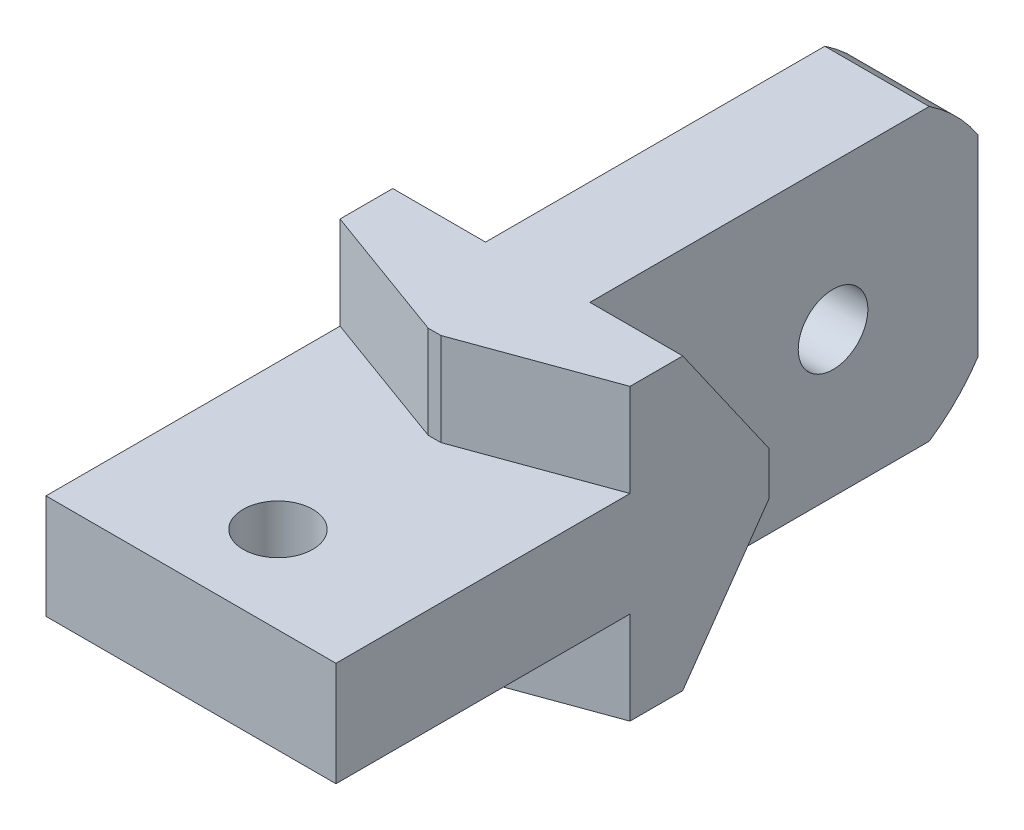
ISO-10303-21;
HEADER;
FILE_DESCRIPTION(('STEP AP214'),'2;1');
FILE_NAME('part.step','',(''),(''),'','','');
FILE_SCHEMA(('AUTOMOTIVE_DESIGN { 1 0 10303 214 1 1 1 1 }'));
ENDSEC;
DATA;
#1=APPLICATION_CONTEXT('core data for automotive mechanical design processes');
#2=APPLICATION_PROTOCOL_DEFINITION('international standard','automotive_design',2000,#1);
#3=PRODUCT_CONTEXT('',#1,'mechanical');
#4=PRODUCT('Part','Part','',(#3));
#5=PRODUCT_RELATED_PRODUCT_CATEGORY('part','',(#4));
#6=PRODUCT_DEFINITION_FORMATION('','',#4);
#7=PRODUCT_DEFINITION_CONTEXT('part definition',#1,'design');
#8=PRODUCT_DEFINITION('design','',#6,#7);
#9=PRODUCT_DEFINITION_SHAPE('','',#8);
#10=(LENGTH_UNIT() NAMED_UNIT(*) SI_UNIT(.MILLI.,.METRE.));
#11=(NAMED_UNIT(*) PLANE_ANGLE_UNIT() SI_UNIT($,.RADIAN.));
#12=(NAMED_UNIT(*) SI_UNIT($,.STERADIAN.) SOLID_ANGLE_UNIT());
#13=UNCERTAINTY_MEASURE_WITH_UNIT(LENGTH_MEASURE(1.E-05),#10,'distance_accuracy_value','');
#14=(GEOMETRIC_REPRESENTATION_CONTEXT(3) GLOBAL_UNCERTAINTY_ASSIGNED_CONTEXT((#13)) GLOBAL_UNIT_ASSIGNED_CONTEXT((#10,
#11,#12)) REPRESENTATION_CONTEXT('',''));
#15=CARTESIAN_POINT('',(0.,0.,0.));
#16=DIRECTION('',(0.,0.,1.));
#17=DIRECTION('',(1.,0.,0.));
#18=AXIS2_PLACEMENT_3D('',#15,#16,#17);
#19=CARTESIAN_POINT('',(12.5,12.5,-68.3590613364812));
#20=DIRECTION('',(-1.,0.,0.));
#21=DIRECTION('',(0.,-1.,0.));
#22=AXIS2_PLACEMENT_3D('',#19,#20,#21);
#23=PLANE('',#22);
#24=DIRECTION('',(0.,-0.819152044288995,-0.573576436351042));
#25=VECTOR('',#24,1.);
#26=CARTESIAN_POINT('',(12.5,-3.22121734763681,-45.9068361178939));
#27=LINE('',#26,#25);
#28=CARTESIAN_POINT('',(12.5,12.5,-34.8987212212454));
#29=VERTEX_POINT('',#28);
#30=CARTESIAN_POINT('',(12.5,1.84553013480768,-42.3590613364812));
#31=VERTEX_POINT('',#30);
#32=EDGE_CURVE('E522',#29,#31,#27,.T.);
#33=ORIENTED_EDGE('',*,*,#32,.F.);
#34=DIRECTION('',(0.,0.,1.));
#35=VECTOR('',#34,1.);
#36=CARTESIAN_POINT('',(12.5,12.5,-68.3590613364812));
#37=LINE('',#36,#35);
#38=CARTESIAN_POINT('',(12.5,12.5,-30.3518500842764));
#39=VERTEX_POINT('',#38);
#40=EDGE_CURVE('E468',#29,#39,#37,.T.);
#41=ORIENTED_EDGE('',*,*,#40,.T.);
#42=DIRECTION('',(0.,-1.,0.));
#43=VECTOR('',#42,1.);
#44=CARTESIAN_POINT('',(12.5,12.5,-30.3518500842764));
#45=LINE('',#44,#43);
#46=CARTESIAN_POINT('',(12.5,4.5,-30.3518500842764));
#47=VERTEX_POINT('',#46);
#48=EDGE_CURVE('E484',#39,#47,#45,.T.);
#49=ORIENTED_EDGE('',*,*,#48,.T.);
#50=DIRECTION('',(0.,0.,1.));
#51=VECTOR('',#50,1.);
#52=CARTESIAN_POINT('',(12.5,4.5,-26.));
#53=LINE('',#52,#51);
#54=CARTESIAN_POINT('',(12.5,4.5,-5.));
#55=VERTEX_POINT('',#54);
#56=EDGE_CURVE('E461',#47,#55,#53,.T.);
#57=ORIENTED_EDGE('',*,*,#56,.T.);
#58=DIRECTION('',(0.,1.,0.));
#59=VECTOR('',#58,1.);
#60=CARTESIAN_POINT('',(12.5,-4.5,-5.));
#61=LINE('',#60,#59);
#62=CARTESIAN_POINT('',(12.5,-4.5,-5.00000000000001));
#63=VERTEX_POINT('',#62);
#64=EDGE_CURVE('E417',#63,#55,#61,.T.);
#65=ORIENTED_EDGE('',*,*,#64,.F.);
#66=DIRECTION('',(0.,0.,1.));
#67=VECTOR('',#66,1.);
#68=CARTESIAN_POINT('',(12.5,-4.5,-26.));
#69=LINE('',#68,#67);
#70=CARTESIAN_POINT('',(12.5,-4.5,-30.3518500842764));
#71=VERTEX_POINT('',#70);
#72=EDGE_CURVE('E447',#71,#63,#69,.T.);
#73=ORIENTED_EDGE('',*,*,#72,.F.);
#74=DIRECTION('',(0.,1.,0.));
#75=VECTOR('',#74,1.);
#76=CARTESIAN_POINT('',(12.5,12.5,-30.3518500842764));
#77=LINE('',#76,#75);
#78=CARTESIAN_POINT('',(12.5,-12.5,-30.3518500842764));
#79=VERTEX_POINT('',#78);
#80=EDGE_CURVE('E577',#79,#71,#77,.T.);
#81=ORIENTED_EDGE('',*,*,#80,.F.);
#82=DIRECTION('',(0.,0.,1.));
#83=VECTOR('',#82,1.);
#84=CARTESIAN_POINT('',(12.5,-12.5,-68.3590613364812));
#85=LINE('',#84,#83);
#86=CARTESIAN_POINT('',(12.5,-12.5,-34.8987212212454));
#87=VERTEX_POINT('',#86);
#88=EDGE_CURVE('E451',#87,#79,#85,.T.);
#89=ORIENTED_EDGE('',*,*,#88,.F.);
#90=DIRECTION('',(0.,0.819152044288995,-0.573576436351042));
#91=VECTOR('',#90,1.);
#92=CARTESIAN_POINT('',(12.5,19.9964691392078,-57.6529938777177));
#93=LINE('',#92,#91);
#94=CARTESIAN_POINT('',(12.5,-1.8455301348077,-42.3590613364812));
#95=VERTEX_POINT('',#94);
#96=EDGE_CURVE('E546',#87,#95,#93,.T.);
#97=ORIENTED_EDGE('',*,*,#96,.T.);
#98=DIRECTION('',(0.,-1.,0.));
#99=VECTOR('',#98,1.);
#100=CARTESIAN_POINT('',(12.5,-12.5,-42.3590613364812));
#101=LINE('',#100,#99);
#102=EDGE_CURVE('E430',#31,#95,#101,.T.);
#103=ORIENTED_EDGE('',*,*,#102,.F.);
#104=EDGE_LOOP('',(#33,#41,#49,#57,#65,#73,#81,#89,#97,#103));
#105=FACE_BOUND('',#104,.T.);
#106=ADVANCED_FACE('F219',(#105),#23,.F.);
#107=CARTESIAN_POINT('',(12.5,12.5,-68.3590613364812));
#108=DIRECTION('',(0.,1.,0.));
#109=DIRECTION('',(-1.,0.,0.));
#110=AXIS2_PLACEMENT_3D('',#107,#108,#109);
#111=PLANE('',#110);
#112=DIRECTION('',(-1.,0.,0.));
#113=VECTOR('',#112,1.);
#114=CARTESIAN_POINT('',(5.49999999999996,12.5,-64.1506233123697));
#115=LINE('',#114,#113);
#116=CARTESIAN_POINT('',(4.49999999999996,12.5,-64.1506233123697));
#117=VERTEX_POINT('',#116);
#118=CARTESIAN_POINT('',(-4.50000000000004,12.5,-64.1506233123697));
#119=VERTEX_POINT('',#118);
#120=EDGE_CURVE('E235',#117,#119,#115,.T.);
#121=ORIENTED_EDGE('',*,*,#120,.T.);
#122=DIRECTION('',(0.,0.,-1.));
#123=VECTOR('',#122,1.);
#124=CARTESIAN_POINT('',(-4.50000000000004,12.5,-42.3590613364812));
#125=LINE('',#124,#123);
#126=CARTESIAN_POINT('',(-4.49999999999996,12.5,-34.8987212212454));
#127=VERTEX_POINT('',#126);
#128=EDGE_CURVE('E381',#127,#119,#125,.T.);
#129=ORIENTED_EDGE('',*,*,#128,.F.);
#130=DIRECTION('',(1.,0.,0.));
#131=VECTOR('',#130,1.);
#132=CARTESIAN_POINT('',(12.4999999999999,12.5,-34.8987212212454));
#133=LINE('',#132,#131);
#134=CARTESIAN_POINT('',(-12.5,12.5,-34.8987212212454));
#135=VERTEX_POINT('',#134);
#136=EDGE_CURVE('E530',#135,#127,#133,.T.);
#137=ORIENTED_EDGE('',*,*,#136,.F.);
#138=DIRECTION('',(0.,0.,1.));
#139=VECTOR('',#138,1.);
#140=CARTESIAN_POINT('',(-12.5,12.5,-68.3590613364812));
#141=LINE('',#140,#139);
#142=CARTESIAN_POINT('',(-12.5,12.5,-30.3518500842764));
#143=VERTEX_POINT('',#142);
#144=EDGE_CURVE('E471',#135,#143,#141,.T.);
#145=ORIENTED_EDGE('',*,*,#144,.T.);
#146=DIRECTION('',(0.939692620785909,0.,0.342020143325666));
#147=VECTOR('',#146,1.);
#148=CARTESIAN_POINT('',(-2.63972669684068,12.5,-26.7630041001967));
#149=LINE('',#148,#147);
#150=CARTESIAN_POINT('',(-0.543390160598878,12.5,-26.));
#151=VERTEX_POINT('',#150);
#152=EDGE_CURVE('E477',#143,#151,#149,.T.);
#153=ORIENTED_EDGE('',*,*,#152,.T.);
#154=DIRECTION('',(1.,0.,0.));
#155=VECTOR('',#154,1.);
#156=CARTESIAN_POINT('',(0.,12.5,-26.));
#157=LINE('',#156,#155);
#158=CARTESIAN_POINT('',(0.54339016059887,12.5,-26.));
#159=VERTEX_POINT('',#158);
#160=EDGE_CURVE('E457',#151,#159,#157,.T.);
#161=ORIENTED_EDGE('',*,*,#160,.T.);
#162=DIRECTION('',(0.939692620785909,0.,-0.342020143325666));
#163=VECTOR('',#162,1.);
#164=CARTESIAN_POINT('',(-8.29267435211167,12.5,-22.7839355293175));
#165=LINE('',#164,#163);
#166=EDGE_CURVE('E593',#159,#39,#165,.T.);
#167=ORIENTED_EDGE('',*,*,#166,.T.);
#168=ORIENTED_EDGE('',*,*,#40,.F.);
#169=DIRECTION('',(-1.,0.,0.));
#170=VECTOR('',#169,1.);
#171=CARTESIAN_POINT('',(12.5000000000001,12.5,-34.8987212212454));
#172=LINE('',#171,#170);
#173=CARTESIAN_POINT('',(4.49999999999996,12.5,-34.8987212212454));
#174=VERTEX_POINT('',#173);
#175=EDGE_CURVE('E525',#29,#174,#172,.T.);
#176=ORIENTED_EDGE('',*,*,#175,.T.);
#177=DIRECTION('',(0.,0.,-1.));
#178=VECTOR('',#177,1.);
#179=CARTESIAN_POINT('',(4.49999999999996,12.5,-42.3590613364812));
#180=LINE('',#179,#178);
#181=EDGE_CURVE('E384',#174,#117,#180,.T.);
#182=ORIENTED_EDGE('',*,*,#181,.T.);
#183=EDGE_LOOP('',(#121,#129,#137,#145,#153,#161,#167,#168,#176,#182));
#184=FACE_BOUND('',#183,.T.);
#185=ADVANCED_FACE('F379',(#184),#111,.T.);
#186=CARTESIAN_POINT('',(0.,0.,-42.3590613364812));
#187=DIRECTION('',(0.,0.,-1.));
#188=DIRECTION('',(-1.,0.,0.));
#189=AXIS2_PLACEMENT_3D('',#186,#187,#188);
#190=PLANE('',#189);
#191=DIRECTION('',(0.,1.,0.));
#192=VECTOR('',#191,1.);
#193=CARTESIAN_POINT('',(4.5,0.,-42.3590613364812));
#194=LINE('',#193,#192);
#195=CARTESIAN_POINT('',(4.49999999999999,-1.84553013480768,-42.3590613364812));
#196=VERTEX_POINT('',#195);
#197=CARTESIAN_POINT('',(4.49999999999999,1.84553013480767,-42.3590613364812));
#198=VERTEX_POINT('',#197);
#199=EDGE_CURVE('E402',#196,#198,#194,.T.);
#200=ORIENTED_EDGE('',*,*,#199,.T.);
#201=DIRECTION('',(1.,0.,0.));
#202=VECTOR('',#201,1.);
#203=CARTESIAN_POINT('',(0.,1.84553013480765,-42.3590613364812));
#204=LINE('',#203,#202);
#205=EDGE_CURVE('E509',#198,#31,#204,.T.);
#206=ORIENTED_EDGE('',*,*,#205,.T.);
#207=ORIENTED_EDGE('',*,*,#102,.T.);
#208=DIRECTION('',(1.,0.,0.));
#209=VECTOR('',#208,1.);
#210=CARTESIAN_POINT('',(0.,-1.84553013480765,-42.3590613364812));
#211=LINE('',#210,#209);
#212=EDGE_CURVE('E542',#196,#95,#211,.T.);
#213=ORIENTED_EDGE('',*,*,#212,.F.);
#214=EDGE_LOOP('',(#200,#206,#207,#213));
#215=FACE_BOUND('',#214,.T.);
#216=ADVANCED_FACE('F652',(#215),#190,.T.);
#217=CARTESIAN_POINT('',(12.5,-12.5,-68.3590613364812));
#218=DIRECTION('',(0.,1.,0.));
#219=DIRECTION('',(-1.,0.,0.));
#220=AXIS2_PLACEMENT_3D('',#217,#218,#219);
#221=PLANE('',#220);
#222=DIRECTION('',(0.,0.,-1.));
#223=VECTOR('',#222,1.);
#224=CARTESIAN_POINT('',(-4.49999999999996,-12.5,-42.3590613364812));
#225=LINE('',#224,#223);
#226=CARTESIAN_POINT('',(-4.49999999999996,-12.5,-34.8987212212454));
#227=VERTEX_POINT('',#226);
#228=CARTESIAN_POINT('',(-4.49999999999996,-12.5,-64.1506233123697));
#229=VERTEX_POINT('',#228);
#230=EDGE_CURVE('E393',#227,#229,#225,.T.);
#231=ORIENTED_EDGE('',*,*,#230,.T.);
#232=DIRECTION('',(-1.,0.,0.));
#233=VECTOR('',#232,1.);
#234=CARTESIAN_POINT('',(5.50000000000004,-12.5,-64.1506233123697));
#235=LINE('',#234,#233);
#236=CARTESIAN_POINT('',(4.50000000000004,-12.5,-64.1506233123697));
#237=VERTEX_POINT('',#236);
#238=EDGE_CURVE('E375',#237,#229,#235,.T.);
#239=ORIENTED_EDGE('',*,*,#238,.F.);
#240=DIRECTION('',(0.,0.,-1.));
#241=VECTOR('',#240,1.);
#242=CARTESIAN_POINT('',(4.50000000000004,-12.5,-42.3590613364812));
#243=LINE('',#242,#241);
#244=CARTESIAN_POINT('',(4.49999999999996,-12.5,-34.8987212212454));
#245=VERTEX_POINT('',#244);
#246=EDGE_CURVE('E412',#245,#237,#243,.T.);
#247=ORIENTED_EDGE('',*,*,#246,.F.);
#248=DIRECTION('',(1.,0.,0.));
#249=VECTOR('',#248,1.);
#250=CARTESIAN_POINT('',(12.5000000000001,-12.5,-34.8987212212454));
#251=LINE('',#250,#249);
#252=EDGE_CURVE('E550',#245,#87,#251,.T.);
#253=ORIENTED_EDGE('',*,*,#252,.T.);
#254=ORIENTED_EDGE('',*,*,#88,.T.);
#255=DIRECTION('',(0.939692620785909,0.,-0.342020143325666));
#256=VECTOR('',#255,1.);
#257=CARTESIAN_POINT('',(24.715282235828,-12.5,-34.7978492212784));
#258=LINE('',#257,#256);
#259=CARTESIAN_POINT('',(0.543390160598841,-12.5,-26.));
#260=VERTEX_POINT('',#259);
#261=EDGE_CURVE('E492',#260,#79,#258,.T.);
#262=ORIENTED_EDGE('',*,*,#261,.F.);
#263=DIRECTION('',(-1.,0.,0.));
#264=VECTOR('',#263,1.);
#265=CARTESIAN_POINT('',(0.,-12.5,-26.));
#266=LINE('',#265,#264);
#267=CARTESIAN_POINT('',(-0.543390160598876,-12.5,-26.));
#268=VERTEX_POINT('',#267);
#269=EDGE_CURVE('E439',#260,#268,#266,.T.);
#270=ORIENTED_EDGE('',*,*,#269,.T.);
#271=DIRECTION('',(-0.939692620785909,0.,-0.342020143325666));
#272=VECTOR('',#271,1.);
#273=CARTESIAN_POINT('',(-2.63972669684068,-12.5,-26.7630041001967));
#274=LINE('',#273,#272);
#275=CARTESIAN_POINT('',(-12.5,-12.5,-30.3518500842764));
#276=VERTEX_POINT('',#275);
#277=EDGE_CURVE('E488',#268,#276,#274,.T.);
#278=ORIENTED_EDGE('',*,*,#277,.T.);
#279=DIRECTION('',(0.,0.,1.));
#280=VECTOR('',#279,1.);
#281=CARTESIAN_POINT('',(-12.5,-12.5,-68.3590613364812));
#282=LINE('',#281,#280);
#283=CARTESIAN_POINT('',(-12.5,-12.5,-34.8987212212454));
#284=VERTEX_POINT('',#283);
#285=EDGE_CURVE('E474',#284,#276,#282,.T.);
#286=ORIENTED_EDGE('',*,*,#285,.F.);
#287=DIRECTION('',(-1.,0.,0.));
#288=VECTOR('',#287,1.);
#289=CARTESIAN_POINT('',(12.4999999999999,-12.5,-34.8987212212454));
#290=LINE('',#289,#288);
#291=EDGE_CURVE('E566',#227,#284,#290,.T.);
#292=ORIENTED_EDGE('',*,*,#291,.F.);
#293=EDGE_LOOP('',(#231,#239,#247,#253,#254,#262,#270,#278,#286,#292));
#294=FACE_BOUND('',#293,.T.);
#295=ADVANCED_FACE('F221',(#294),#221,.F.);
#296=CARTESIAN_POINT('',(-12.5,12.5,-68.3590613364812));
#297=DIRECTION('',(-1.,0.,0.));
#298=DIRECTION('',(0.,-1.,0.));
#299=AXIS2_PLACEMENT_3D('',#296,#297,#298);
#300=PLANE('',#299);
#301=DIRECTION('',(0.,0.819152044288995,0.573576436351042));
#302=VECTOR('',#301,1.);
#303=CARTESIAN_POINT('',(-12.5,-3.22121734763681,-45.9068361178939));
#304=LINE('',#303,#302);
#305=CARTESIAN_POINT('',(-12.5,1.8455301348077,-42.3590613364812));
#306=VERTEX_POINT('',#305);
#307=EDGE_CURVE('E533',#306,#135,#304,.T.);
#308=ORIENTED_EDGE('',*,*,#307,.F.);
#309=DIRECTION('',(0.,1.,0.));
#310=VECTOR('',#309,1.);
#311=CARTESIAN_POINT('',(-12.5,-12.5,-42.3590613364812));
#312=LINE('',#311,#310);
#313=CARTESIAN_POINT('',(-12.5,-1.84553013480768,-42.3590613364812));
#314=VERTEX_POINT('',#313);
#315=EDGE_CURVE('E426',#314,#306,#312,.T.);
#316=ORIENTED_EDGE('',*,*,#315,.F.);
#317=DIRECTION('',(0.,-0.819152044288995,0.573576436351042));
#318=VECTOR('',#317,1.);
#319=CARTESIAN_POINT('',(-12.5,19.9964691392078,-57.6529938777177));
#320=LINE('',#319,#318);
#321=EDGE_CURVE('E562',#314,#284,#320,.T.);
#322=ORIENTED_EDGE('',*,*,#321,.T.);
#323=ORIENTED_EDGE('',*,*,#285,.T.);
#324=DIRECTION('',(0.,-1.,0.));
#325=VECTOR('',#324,1.);
#326=CARTESIAN_POINT('',(-12.5,12.5,-30.3518500842764));
#327=LINE('',#326,#325);
#328=CARTESIAN_POINT('',(-12.5,-4.5,-30.3518500842764));
#329=VERTEX_POINT('',#328);
#330=EDGE_CURVE('E588',#329,#276,#327,.T.);
#331=ORIENTED_EDGE('',*,*,#330,.F.);
#332=DIRECTION('',(0.,0.,1.));
#333=VECTOR('',#332,1.);
#334=CARTESIAN_POINT('',(-12.5,-4.5,-26.));
#335=LINE('',#334,#333);
#336=CARTESIAN_POINT('',(-12.5,-4.5,-5.));
#337=VERTEX_POINT('',#336);
#338=EDGE_CURVE('E448',#329,#337,#335,.T.);
#339=ORIENTED_EDGE('',*,*,#338,.T.);
#340=DIRECTION('',(0.,-1.,0.));
#341=VECTOR('',#340,1.);
#342=CARTESIAN_POINT('',(-12.5,4.5,-5.));
#343=LINE('',#342,#341);
#344=CARTESIAN_POINT('',(-12.5,4.5,-5.));
#345=VERTEX_POINT('',#344);
#346=EDGE_CURVE('E619',#345,#337,#343,.T.);
#347=ORIENTED_EDGE('',*,*,#346,.F.);
#348=DIRECTION('',(0.,0.,1.));
#349=VECTOR('',#348,1.);
#350=CARTESIAN_POINT('',(-12.5,4.5,-26.));
#351=LINE('',#350,#349);
#352=CARTESIAN_POINT('',(-12.5,4.5,-30.3518500842764));
#353=VERTEX_POINT('',#352);
#354=EDGE_CURVE('E443',#353,#345,#351,.T.);
#355=ORIENTED_EDGE('',*,*,#354,.F.);
#356=DIRECTION('',(0.,1.,0.));
#357=VECTOR('',#356,1.);
#358=CARTESIAN_POINT('',(-12.5,12.5,-30.3518500842764));
#359=LINE('',#358,#357);
#360=EDGE_CURVE('E611',#353,#143,#359,.T.);
#361=ORIENTED_EDGE('',*,*,#360,.T.);
#362=ORIENTED_EDGE('',*,*,#144,.F.);
#363=EDGE_LOOP('',(#308,#316,#322,#323,#331,#339,#347,#355,#361,#362));
#364=FACE_BOUND('',#363,.T.);
#365=ADVANCED_FACE('F658',(#364),#300,.T.);
#366=DIRECTION('',(-1.,0.,0.));
#367=VECTOR('',#366,1.);
#368=CARTESIAN_POINT('',(0.,1.84553013480765,-42.3590613364812));
#369=LINE('',#368,#367);
#370=CARTESIAN_POINT('',(-4.49999999999999,1.84553013480768,-42.3590613364812));
#371=VERTEX_POINT('',#370);
#372=EDGE_CURVE('E536',#371,#306,#369,.T.);
#373=ORIENTED_EDGE('',*,*,#372,.F.);
#374=DIRECTION('',(0.,1.,0.));
#375=VECTOR('',#374,1.);
#376=CARTESIAN_POINT('',(-4.5,0.,-42.3590613364812));
#377=LINE('',#376,#375);
#378=CARTESIAN_POINT('',(-4.49999999999999,-1.84553013480768,-42.3590613364812));
#379=VERTEX_POINT('',#378);
#380=EDGE_CURVE('E399',#379,#371,#377,.T.);
#381=ORIENTED_EDGE('',*,*,#380,.F.);
#382=DIRECTION('',(-1.,0.,0.));
#383=VECTOR('',#382,1.);
#384=CARTESIAN_POINT('',(0.,-1.84553013480765,-42.3590613364812));
#385=LINE('',#384,#383);
#386=EDGE_CURVE('E558',#379,#314,#385,.T.);
#387=ORIENTED_EDGE('',*,*,#386,.T.);
#388=ORIENTED_EDGE('',*,*,#315,.T.);
#389=EDGE_LOOP('',(#373,#381,#387,#388));
#390=FACE_BOUND('',#389,.T.);
#391=ADVANCED_FACE('F660',(#390),#190,.T.);
#392=CARTESIAN_POINT('',(0.,0.,-26.));
#393=DIRECTION('',(0.,0.,1.));
#394=DIRECTION('',(-1.,0.,0.));
#395=AXIS2_PLACEMENT_3D('',#392,#393,#394);
#396=PLANE('',#395);
#397=ORIENTED_EDGE('',*,*,#269,.F.);
#398=DIRECTION('',(0.,1.,0.));
#399=VECTOR('',#398,1.);
#400=CARTESIAN_POINT('',(0.543390160598869,0.,-26.));
#401=LINE('',#400,#399);
#402=CARTESIAN_POINT('',(0.543390160598867,-4.5,-26.));
#403=VERTEX_POINT('',#402);
#404=EDGE_CURVE('E573',#260,#403,#401,.T.);
#405=ORIENTED_EDGE('',*,*,#404,.T.);
#406=DIRECTION('',(1.,0.,0.));
#407=VECTOR('',#406,1.);
#408=CARTESIAN_POINT('',(0.,-4.5,-26.));
#409=LINE('',#408,#407);
#410=CARTESIAN_POINT('',(-0.543390160598867,-4.5,-26.));
#411=VERTEX_POINT('',#410);
#412=EDGE_CURVE('E442',#411,#403,#409,.T.);
#413=ORIENTED_EDGE('',*,*,#412,.F.);
#414=DIRECTION('',(0.,1.,0.));
#415=VECTOR('',#414,1.);
#416=CARTESIAN_POINT('',(-0.543390160598869,0.,-26.));
#417=LINE('',#416,#415);
#418=EDGE_CURVE('E585',#268,#411,#417,.T.);
#419=ORIENTED_EDGE('',*,*,#418,.F.);
#420=EDGE_LOOP('',(#397,#405,#413,#419));
#421=FACE_BOUND('',#420,.T.);
#422=ADVANCED_FACE('F666',(#421),#396,.T.);
#423=CARTESIAN_POINT('',(0.,0.,-26.));
#424=DIRECTION('',(0.,0.,1.));
#425=DIRECTION('',(-1.,0.,0.));
#426=AXIS2_PLACEMENT_3D('',#423,#424,#425);
#427=PLANE('',#426);
#428=DIRECTION('',(0.,-1.,0.));
#429=VECTOR('',#428,1.);
#430=CARTESIAN_POINT('',(0.543390160598869,0.,-26.));
#431=LINE('',#430,#429);
#432=CARTESIAN_POINT('',(0.543390160598869,4.5,-26.));
#433=VERTEX_POINT('',#432);
#434=EDGE_CURVE('E597',#159,#433,#431,.T.);
#435=ORIENTED_EDGE('',*,*,#434,.F.);
#436=ORIENTED_EDGE('',*,*,#160,.F.);
#437=DIRECTION('',(0.,-1.,0.));
#438=VECTOR('',#437,1.);
#439=CARTESIAN_POINT('',(-0.543390160598869,0.,-26.));
#440=LINE('',#439,#438);
#441=CARTESIAN_POINT('',(-0.54339016059887,4.5,-26.));
#442=VERTEX_POINT('',#441);
#443=EDGE_CURVE('E607',#151,#442,#440,.T.);
#444=ORIENTED_EDGE('',*,*,#443,.T.);
#445=DIRECTION('',(1.,0.,0.));
#446=VECTOR('',#445,1.);
#447=CARTESIAN_POINT('',(0.,4.5,-26.));
#448=LINE('',#447,#446);
#449=EDGE_CURVE('E438',#442,#433,#448,.T.);
#450=ORIENTED_EDGE('',*,*,#449,.T.);
#451=EDGE_LOOP('',(#435,#436,#444,#450));
#452=FACE_BOUND('',#451,.T.);
#453=ADVANCED_FACE('F711',(#452),#427,.T.);
#454=CARTESIAN_POINT('',(0.,-4.5,-26.));
#455=DIRECTION('',(0.,-1.,0.));
#456=DIRECTION('',(0.,0.,-1.));
#457=AXIS2_PLACEMENT_3D('',#454,#455,#456);
#458=PLANE('',#457);
#459=CARTESIAN_POINT('',(0.,-4.5,-12.5));
#460=DIRECTION('',(0.,-1.,0.));
#461=DIRECTION('',(0.,0.,-1.));
#462=AXIS2_PLACEMENT_3D('',#459,#460,#461);
#463=CIRCLE('',#462,3.);
#464=CARTESIAN_POINT('',(0.,-4.5,-9.49999999999999));
#465=VERTEX_POINT('',#464);
#466=EDGE_CURVE('E433',#465,#465,#463,.T.);
#467=ORIENTED_EDGE('',*,*,#466,.F.);
#468=EDGE_LOOP('',(#467));
#469=FACE_BOUND('',#468,.T.);
#470=ORIENTED_EDGE('',*,*,#72,.T.);
#471=DIRECTION('',(1.,0.,0.));
#472=VECTOR('',#471,1.);
#473=CARTESIAN_POINT('',(-12.5,-4.5,-5.));
#474=LINE('',#473,#472);
#475=EDGE_CURVE('E623',#337,#63,#474,.T.);
#476=ORIENTED_EDGE('',*,*,#475,.F.);
#477=ORIENTED_EDGE('',*,*,#338,.F.);
#478=DIRECTION('',(-0.939692620785909,0.,-0.342020143325666));
#479=VECTOR('',#478,1.);
#480=CARTESIAN_POINT('',(8.29267435211167,-4.5,-22.7839355293175));
#481=LINE('',#480,#479);
#482=EDGE_CURVE('E581',#411,#329,#481,.T.);
#483=ORIENTED_EDGE('',*,*,#482,.F.);
#484=ORIENTED_EDGE('',*,*,#412,.T.);
#485=DIRECTION('',(0.939692620785909,0.,-0.342020143325666));
#486=VECTOR('',#485,1.);
#487=CARTESIAN_POINT('',(-8.29267435211167,-4.5,-22.7839355293175));
#488=LINE('',#487,#486);
#489=EDGE_CURVE('E569',#403,#71,#488,.T.);
#490=ORIENTED_EDGE('',*,*,#489,.T.);
#491=EDGE_LOOP('',(#470,#476,#477,#483,#484,#490));
#492=FACE_BOUND('',#491,.T.);
#493=ADVANCED_FACE('F694',(#469,#492),#458,.T.);
#494=CARTESIAN_POINT('',(0.,4.5,-26.));
#495=DIRECTION('',(0.,-1.,0.));
#496=DIRECTION('',(0.,0.,-1.));
#497=AXIS2_PLACEMENT_3D('',#494,#495,#496);
#498=PLANE('',#497);
#499=DIRECTION('',(-1.,0.,0.));
#500=VECTOR('',#499,1.);
#501=CARTESIAN_POINT('',(12.5,4.5,-5.));
#502=LINE('',#501,#500);
#503=EDGE_CURVE('E615',#55,#345,#502,.T.);
#504=ORIENTED_EDGE('',*,*,#503,.F.);
#505=ORIENTED_EDGE('',*,*,#56,.F.);
#506=DIRECTION('',(0.939692620785909,0.,-0.342020143325666));
#507=VECTOR('',#506,1.);
#508=CARTESIAN_POINT('',(-8.29267435211167,4.5,-22.7839355293175));
#509=LINE('',#508,#507);
#510=EDGE_CURVE('E592',#433,#47,#509,.T.);
#511=ORIENTED_EDGE('',*,*,#510,.F.);
#512=ORIENTED_EDGE('',*,*,#449,.F.);
#513=DIRECTION('',(-0.939692620785909,0.,-0.342020143325666));
#514=VECTOR('',#513,1.);
#515=CARTESIAN_POINT('',(8.29267435211167,4.5,-22.7839355293175));
#516=LINE('',#515,#514);
#517=EDGE_CURVE('E603',#442,#353,#516,.T.);
#518=ORIENTED_EDGE('',*,*,#517,.T.);
#519=ORIENTED_EDGE('',*,*,#354,.T.);
#520=EDGE_LOOP('',(#504,#505,#511,#512,#518,#519));
#521=FACE_BOUND('',#520,.T.);
#522=CARTESIAN_POINT('',(0.,4.5,-12.5));
#523=DIRECTION('',(0.,-1.,0.));
#524=DIRECTION('',(0.,0.,-1.));
#525=AXIS2_PLACEMENT_3D('',#522,#523,#524);
#526=CIRCLE('',#525,3.);
#527=CARTESIAN_POINT('',(0.,4.5,-9.49999999999999));
#528=VERTEX_POINT('',#527);
#529=EDGE_CURVE('E434',#528,#528,#526,.T.);
#530=ORIENTED_EDGE('',*,*,#529,.T.);
#531=EDGE_LOOP('',(#530));
#532=FACE_BOUND('',#531,.T.);
#533=ADVANCED_FACE('F656',(#521,#532),#498,.F.);
#534=CARTESIAN_POINT('',(0.,-35.5,-12.5));
#535=DIRECTION('',(0.,1.,0.));
#536=DIRECTION('',(0.,0.,1.));
#537=AXIS2_PLACEMENT_3D('',#534,#535,#536);
#538=CYLINDRICAL_SURFACE('',#537,3.);
#539=CARTESIAN_POINT('',(0.,-4.5,-9.49999999999999));
#540=CARTESIAN_POINT('',(0.,-4.40625,-9.49999999999999));
#541=CARTESIAN_POINT('',(0.,-4.3125,-9.49999999999999));
#542=CARTESIAN_POINT('',(0.,-4.125,-9.49999999999999));
#543=CARTESIAN_POINT('',(0.,-4.03125,-9.49999999999999));
#544=CARTESIAN_POINT('',(0.,-3.84375,-9.49999999999999));
#545=CARTESIAN_POINT('',(0.,-3.75,-9.49999999999999));
#546=CARTESIAN_POINT('',(0.,-3.5625,-9.49999999999999));
#547=CARTESIAN_POINT('',(0.,-3.46875,-9.49999999999999));
#548=CARTESIAN_POINT('',(0.,-3.28125,-9.49999999999999));
#549=CARTESIAN_POINT('',(0.,-3.1875,-9.49999999999999));
#550=CARTESIAN_POINT('',(0.,-3.,-9.49999999999999));
#551=CARTESIAN_POINT('',(0.,-2.90625,-9.49999999999999));
#552=CARTESIAN_POINT('',(0.,-2.71875,-9.49999999999999));
#553=CARTESIAN_POINT('',(0.,-2.625,-9.49999999999999));
#554=CARTESIAN_POINT('',(0.,-2.4375,-9.49999999999999));
#555=CARTESIAN_POINT('',(0.,-2.34375,-9.49999999999999));
#556=CARTESIAN_POINT('',(0.,-2.15625,-9.49999999999999));
#557=CARTESIAN_POINT('',(0.,-2.0625,-9.49999999999999));
#558=CARTESIAN_POINT('',(0.,-1.875,-9.49999999999999));
#559=CARTESIAN_POINT('',(0.,-1.78125,-9.49999999999999));
#560=CARTESIAN_POINT('',(0.,-1.59375,-9.49999999999999));
#561=CARTESIAN_POINT('',(0.,-1.5,-9.49999999999999));
#562=CARTESIAN_POINT('',(0.,-1.3125,-9.49999999999999));
#563=CARTESIAN_POINT('',(0.,-1.21875,-9.49999999999999));
#564=CARTESIAN_POINT('',(0.,-1.03125,-9.49999999999999));
#565=CARTESIAN_POINT('',(0.,-0.937499999999999,-9.49999999999999));
#566=CARTESIAN_POINT('',(0.,-0.749999999999998,-9.49999999999999));
#567=CARTESIAN_POINT('',(0.,-0.656249999999999,-9.49999999999999));
#568=CARTESIAN_POINT('',(0.,-0.468750000000002,-9.49999999999999));
#569=CARTESIAN_POINT('',(0.,-0.375000000000003,-9.49999999999999));
#570=CARTESIAN_POINT('',(0.,-0.187500000000002,-9.49999999999999));
#571=CARTESIAN_POINT('',(0.,-0.0937500000000012,-9.49999999999999));
#572=CARTESIAN_POINT('',(0.,0.0937500000000012,-9.49999999999999));
#573=CARTESIAN_POINT('',(0.,0.187500000000002,-9.49999999999999));
#574=CARTESIAN_POINT('',(0.,0.375000000000003,-9.49999999999999));
#575=CARTESIAN_POINT('',(0.,0.468750000000002,-9.49999999999999));
#576=CARTESIAN_POINT('',(0.,0.656249999999999,-9.49999999999999));
#577=CARTESIAN_POINT('',(0.,0.749999999999998,-9.49999999999999));
#578=CARTESIAN_POINT('',(0.,0.937499999999999,-9.49999999999999));
#579=CARTESIAN_POINT('',(0.,1.03125,-9.49999999999999));
#580=CARTESIAN_POINT('',(0.,1.21875,-9.49999999999999));
#581=CARTESIAN_POINT('',(0.,1.3125,-9.49999999999999));
#582=CARTESIAN_POINT('',(0.,1.5,-9.49999999999999));
#583=CARTESIAN_POINT('',(0.,1.59375,-9.49999999999999));
#584=CARTESIAN_POINT('',(0.,1.78125,-9.49999999999999));
#585=CARTESIAN_POINT('',(0.,1.875,-9.49999999999999));
#586=CARTESIAN_POINT('',(0.,2.0625,-9.49999999999999));
#587=CARTESIAN_POINT('',(0.,2.15625,-9.49999999999999));
#588=CARTESIAN_POINT('',(0.,2.34375,-9.49999999999999));
#589=CARTESIAN_POINT('',(0.,2.4375,-9.49999999999999));
#590=CARTESIAN_POINT('',(0.,2.625,-9.49999999999999));
#591=CARTESIAN_POINT('',(0.,2.71875,-9.49999999999999));
#592=CARTESIAN_POINT('',(0.,2.90625,-9.49999999999999));
#593=CARTESIAN_POINT('',(0.,3.,-9.49999999999999));
#594=CARTESIAN_POINT('',(0.,3.1875,-9.49999999999999));
#595=CARTESIAN_POINT('',(0.,3.28125,-9.49999999999999));
#596=CARTESIAN_POINT('',(0.,3.46875,-9.49999999999999));
#597=CARTESIAN_POINT('',(0.,3.5625,-9.49999999999999));
#598=CARTESIAN_POINT('',(0.,3.75,-9.49999999999999));
#599=CARTESIAN_POINT('',(0.,3.84375,-9.49999999999999));
#600=CARTESIAN_POINT('',(0.,4.03125,-9.49999999999999));
#601=CARTESIAN_POINT('',(0.,4.125,-9.49999999999999));
#602=CARTESIAN_POINT('',(0.,4.3125,-9.49999999999999));
#603=CARTESIAN_POINT('',(0.,4.40625,-9.49999999999999));
#604=CARTESIAN_POINT('',(0.,4.5,-9.49999999999999));
#605=B_SPLINE_CURVE_WITH_KNOTS('',3,(#539,#540,#541,#542,#543,#544,#545,#546,#547,#548,#549,
#550,#551,#552,#553,#554,#555,#556,#557,#558,#559,#560,#561,#562,#563,#564,#565,#566,#567,#568,
#569,#570,#571,#572,#573,#574,#575,#576,#577,#578,#579,#580,#581,#582,#583,#584,#585,#586,#587,
#588,#589,#590,#591,#592,#593,#594,#595,#596,#597,#598,#599,#600,#601,#602,#603,#604),
.UNSPECIFIED.,.F.,.F.,(4,2,2,2,2,2,2,2,2,2,2,2,2,2,2,2,2,2,2,2,2,2,2,2,2,2,2,2,2,2,2,2,4),(0.,
0.281249999999997,0.5625,0.843749999999997,1.125,1.40625,1.6875,1.96875,2.25,2.53125,2.8125,
3.09375,3.375,3.65625,3.9375,4.21874999999999,4.5,4.78125,5.0625,5.34374999999999,5.625,
5.90624999999999,6.1875,6.46875,6.74999999999999,7.03125,7.31249999999999,7.59375,
7.87499999999999,8.15625,8.43749999999999,8.71875,8.99999999999999),.UNSPECIFIED.);
#606=EDGE_CURVE('BSEAM747',#465,#528,#605,.T.);
#607=ORIENTED_EDGE('',*,*,#466,.T.);
#608=ORIENTED_EDGE('',*,*,#529,.F.);
#609=ORIENTED_EDGE('',*,*,#606,.T.);
#610=ORIENTED_EDGE('',*,*,#606,.F.);
#611=EDGE_LOOP('',(#607,#609,#608,#610));
#612=FACE_BOUND('',#611,.T.);
#613=ADVANCED_FACE('F747',(#612),#538,.F.);
#614=CARTESIAN_POINT('',(0.,0.,-68.3590613364812));
#615=DIRECTION('',(0.,0.,1.));
#616=DIRECTION('',(0.,1.,0.));
#617=AXIS2_PLACEMENT_3D('',#614,#615,#616);
#618=PLANE('',#617);
#619=DIRECTION('',(0.,1.,0.));
#620=VECTOR('',#619,1.);
#621=CARTESIAN_POINT('',(-4.5,0.,-68.3590613364812));
#622=LINE('',#621,#620);
#623=CARTESIAN_POINT('',(-4.49999999999997,-8.29156197588852,-68.3590613364812));
#624=VERTEX_POINT('',#623);
#625=CARTESIAN_POINT('',(-4.50000000000003,8.29156197588849,-68.3590613364812));
#626=VERTEX_POINT('',#625);
#627=EDGE_CURVE('E406',#624,#626,#622,.T.);
#628=ORIENTED_EDGE('',*,*,#627,.T.);
#629=DIRECTION('',(-1.,0.,0.));
#630=VECTOR('',#629,1.);
#631=CARTESIAN_POINT('',(5.49999999999997,8.29156197588852,-68.3590613364812));
#632=LINE('',#631,#630);
#633=CARTESIAN_POINT('',(4.49999999999996,8.29156197588852,-68.3590613364812));
#634=VERTEX_POINT('',#633);
#635=EDGE_CURVE('E369',#634,#626,#632,.T.);
#636=ORIENTED_EDGE('',*,*,#635,.F.);
#637=DIRECTION('',(0.,1.,0.));
#638=VECTOR('',#637,1.);
#639=CARTESIAN_POINT('',(4.5,0.,-68.3590613364812));
#640=LINE('',#639,#638);
#641=CARTESIAN_POINT('',(4.50000000000003,-8.29156197588849,-68.3590613364812));
#642=VERTEX_POINT('',#641);
#643=EDGE_CURVE('E394',#642,#634,#640,.T.);
#644=ORIENTED_EDGE('',*,*,#643,.F.);
#645=DIRECTION('',(-1.,0.,0.));
#646=VECTOR('',#645,1.);
#647=CARTESIAN_POINT('',(5.50000000000003,-8.29156197588849,-68.3590613364812));
#648=LINE('',#647,#646);
#649=EDGE_CURVE('E242',#642,#624,#648,.T.);
#650=ORIENTED_EDGE('',*,*,#649,.T.);
#651=EDGE_LOOP('',(#628,#636,#644,#650));
#652=FACE_BOUND('',#651,.T.);
#653=ADVANCED_FACE('F503',(#652),#618,.F.);
#654=CARTESIAN_POINT('',(-4.5,0.,-42.3590613364812));
#655=DIRECTION('',(-1.,0.,0.));
#656=DIRECTION('',(0.,0.,1.));
#657=AXIS2_PLACEMENT_3D('',#654,#655,#656);
#658=PLANE('',#657);
#659=CARTESIAN_POINT('',(-4.5,0.,-55.8590613364812));
#660=DIRECTION('',(1.,0.,0.));
#661=DIRECTION('',(0.,-1.,0.));
#662=AXIS2_PLACEMENT_3D('',#659,#660,#661);
#663=CIRCLE('',#662,15.);
#664=EDGE_CURVE('E366',#626,#119,#663,.T.);
#665=ORIENTED_EDGE('',*,*,#664,.F.);
#666=ORIENTED_EDGE('',*,*,#627,.F.);
#667=CARTESIAN_POINT('',(-4.5,0.,-55.8590613364812));
#668=DIRECTION('',(1.,0.,0.));
#669=DIRECTION('',(0.,-1.,0.));
#670=AXIS2_PLACEMENT_3D('',#667,#668,#669);
#671=CIRCLE('',#670,15.);
#672=EDGE_CURVE('E512',#229,#624,#671,.T.);
#673=ORIENTED_EDGE('',*,*,#672,.F.);
#674=ORIENTED_EDGE('',*,*,#230,.F.);
#675=DIRECTION('',(0.,0.819152044288995,-0.573576436351042));
#676=VECTOR('',#675,1.);
#677=CARTESIAN_POINT('',(-4.50000000000009,26.9840011194845,-62.5457164437888));
#678=LINE('',#677,#676);
#679=EDGE_CURVE('E554',#227,#379,#678,.T.);
#680=ORIENTED_EDGE('',*,*,#679,.T.);
#681=ORIENTED_EDGE('',*,*,#380,.T.);
#682=DIRECTION('',(0.,-0.819152044288995,-0.573576436351042));
#683=VECTOR('',#682,1.);
#684=CARTESIAN_POINT('',(-4.50000000000009,-26.9840011194845,-62.5457164437888));
#685=LINE('',#684,#683);
#686=EDGE_CURVE('E390',#127,#371,#685,.T.);
#687=ORIENTED_EDGE('',*,*,#686,.F.);
#688=ORIENTED_EDGE('',*,*,#128,.T.);
#689=EDGE_LOOP('',(#665,#666,#673,#674,#680,#681,#687,#688));
#690=FACE_BOUND('',#689,.T.);
#691=CARTESIAN_POINT('',(-4.5,0.,-55.8590613364812));
#692=DIRECTION('',(-1.,0.,0.));
#693=DIRECTION('',(0.,0.,1.));
#694=AXIS2_PLACEMENT_3D('',#691,#692,#693);
#695=CIRCLE('',#694,3.);
#696=CARTESIAN_POINT('',(-4.5,0.,-52.8590613364812));
#697=VERTEX_POINT('',#696);
#698=EDGE_CURVE('E409',#697,#697,#695,.F.);
#699=ORIENTED_EDGE('',*,*,#698,.T.);
#700=EDGE_LOOP('',(#699));
#701=FACE_BOUND('',#700,.T.);
#702=ADVANCED_FACE('F387',(#690,#701),#658,.T.);
#703=CARTESIAN_POINT('',(4.5,0.,-42.3590613364812));
#704=DIRECTION('',(-1.,0.,0.));
#705=DIRECTION('',(0.,0.,1.));
#706=AXIS2_PLACEMENT_3D('',#703,#704,#705);
#707=PLANE('',#706);
#708=ORIENTED_EDGE('',*,*,#643,.T.);
#709=CARTESIAN_POINT('',(4.5,0.,-55.8590613364812));
#710=DIRECTION('',(-1.,0.,0.));
#711=DIRECTION('',(0.,-1.,0.));
#712=AXIS2_PLACEMENT_3D('',#709,#710,#711);
#713=CIRCLE('',#712,15.);
#714=EDGE_CURVE('E13',#634,#117,#713,.F.);
#715=ORIENTED_EDGE('',*,*,#714,.T.);
#716=ORIENTED_EDGE('',*,*,#181,.F.);
#717=DIRECTION('',(0.,-0.819152044288995,-0.573576436351042));
#718=VECTOR('',#717,1.);
#719=CARTESIAN_POINT('',(4.50000000000009,-26.9840011194845,-62.5457164437888));
#720=LINE('',#719,#718);
#721=EDGE_CURVE('E505',#174,#198,#720,.T.);
#722=ORIENTED_EDGE('',*,*,#721,.T.);
#723=ORIENTED_EDGE('',*,*,#199,.F.);
#724=DIRECTION('',(0.,0.819152044288995,-0.573576436351042));
#725=VECTOR('',#724,1.);
#726=CARTESIAN_POINT('',(4.50000000000009,26.9840011194845,-62.5457164437888));
#727=LINE('',#726,#725);
#728=EDGE_CURVE('E539',#245,#196,#727,.T.);
#729=ORIENTED_EDGE('',*,*,#728,.F.);
#730=ORIENTED_EDGE('',*,*,#246,.T.);
#731=CARTESIAN_POINT('',(4.5,0.,-55.8590613364812));
#732=DIRECTION('',(-1.,0.,0.));
#733=DIRECTION('',(0.,-1.,0.));
#734=AXIS2_PLACEMENT_3D('',#731,#732,#733);
#735=CIRCLE('',#734,15.);
#736=EDGE_CURVE('E228',#237,#642,#735,.F.);
#737=ORIENTED_EDGE('',*,*,#736,.T.);
#738=EDGE_LOOP('',(#708,#715,#716,#722,#723,#729,#730,#737));
#739=FACE_BOUND('',#738,.T.);
#740=CARTESIAN_POINT('',(4.5,0.,-55.8590613364812));
#741=DIRECTION('',(-1.,0.,0.));
#742=DIRECTION('',(0.,0.,1.));
#743=AXIS2_PLACEMENT_3D('',#740,#741,#742);
#744=CIRCLE('',#743,3.);
#745=CARTESIAN_POINT('',(4.5,0.,-52.8590613364812));
#746=VERTEX_POINT('',#745);
#747=EDGE_CURVE('E425',#746,#746,#744,.F.);
#748=ORIENTED_EDGE('',*,*,#747,.F.);
#749=EDGE_LOOP('',(#748));
#750=FACE_BOUND('',#749,.T.);
#751=ADVANCED_FACE('F498',(#739,#750),#707,.F.);
#752=CARTESIAN_POINT('',(35.5,1.23947587528931E-13,-55.8590613364812));
#753=DIRECTION('',(-1.,0.,0.));
#754=DIRECTION('',(0.,0.,1.));
#755=AXIS2_PLACEMENT_3D('',#752,#753,#754);
#756=CYLINDRICAL_SURFACE('',#755,3.);
#757=CARTESIAN_POINT('',(-4.5,0.,-52.8590613364812));
#758=CARTESIAN_POINT('',(-4.40625,0.,-52.8590613364812));
#759=CARTESIAN_POINT('',(-4.3125,0.,-52.8590613364812));
#760=CARTESIAN_POINT('',(-4.125,0.,-52.8590613364812));
#761=CARTESIAN_POINT('',(-4.03125,0.,-52.8590613364812));
#762=CARTESIAN_POINT('',(-3.84375,0.,-52.8590613364812));
#763=CARTESIAN_POINT('',(-3.75,0.,-52.8590613364812));
#764=CARTESIAN_POINT('',(-3.5625,0.,-52.8590613364812));
#765=CARTESIAN_POINT('',(-3.46875,0.,-52.8590613364812));
#766=CARTESIAN_POINT('',(-3.28125,0.,-52.8590613364812));
#767=CARTESIAN_POINT('',(-3.1875,0.,-52.8590613364812));
#768=CARTESIAN_POINT('',(-3.,0.,-52.8590613364812));
#769=CARTESIAN_POINT('',(-2.90625,0.,-52.8590613364812));
#770=CARTESIAN_POINT('',(-2.71875,0.,-52.8590613364812));
#771=CARTESIAN_POINT('',(-2.625,0.,-52.8590613364812));
#772=CARTESIAN_POINT('',(-2.4375,0.,-52.8590613364812));
#773=CARTESIAN_POINT('',(-2.34375,0.,-52.8590613364812));
#774=CARTESIAN_POINT('',(-2.15625,0.,-52.8590613364812));
#775=CARTESIAN_POINT('',(-2.0625,0.,-52.8590613364812));
#776=CARTESIAN_POINT('',(-1.875,0.,-52.8590613364812));
#777=CARTESIAN_POINT('',(-1.78125,0.,-52.8590613364812));
#778=CARTESIAN_POINT('',(-1.59375,0.,-52.8590613364812));
#779=CARTESIAN_POINT('',(-1.5,0.,-52.8590613364812));
#780=CARTESIAN_POINT('',(-1.3125,0.,-52.8590613364812));
#781=CARTESIAN_POINT('',(-1.21875,0.,-52.8590613364812));
#782=CARTESIAN_POINT('',(-1.03125,0.,-52.8590613364812));
#783=CARTESIAN_POINT('',(-0.937499999999999,0.,-52.8590613364812));
#784=CARTESIAN_POINT('',(-0.749999999999998,0.,-52.8590613364812));
#785=CARTESIAN_POINT('',(-0.656249999999999,0.,-52.8590613364812));
#786=CARTESIAN_POINT('',(-0.468750000000002,0.,-52.8590613364812));
#787=CARTESIAN_POINT('',(-0.375000000000003,0.,-52.8590613364812));
#788=CARTESIAN_POINT('',(-0.187500000000002,0.,-52.8590613364812));
#789=CARTESIAN_POINT('',(-0.0937500000000012,0.,-52.8590613364812));
#790=CARTESIAN_POINT('',(0.0937500000000012,0.,-52.8590613364812));
#791=CARTESIAN_POINT('',(0.187500000000002,0.,-52.8590613364812));
#792=CARTESIAN_POINT('',(0.375000000000003,0.,-52.8590613364812));
#793=CARTESIAN_POINT('',(0.468750000000002,0.,-52.8590613364812));
#794=CARTESIAN_POINT('',(0.656249999999999,0.,-52.8590613364812));
#795=CARTESIAN_POINT('',(0.749999999999998,0.,-52.8590613364812));
#796=CARTESIAN_POINT('',(0.937499999999999,0.,-52.8590613364812));
#797=CARTESIAN_POINT('',(1.03125,0.,-52.8590613364812));
#798=CARTESIAN_POINT('',(1.21875,0.,-52.8590613364812));
#799=CARTESIAN_POINT('',(1.3125,0.,-52.8590613364812));
#800=CARTESIAN_POINT('',(1.5,0.,-52.8590613364812));
#801=CARTESIAN_POINT('',(1.59375,0.,-52.8590613364812));
#802=CARTESIAN_POINT('',(1.78125,0.,-52.8590613364812));
#803=CARTESIAN_POINT('',(1.875,0.,-52.8590613364812));
#804=CARTESIAN_POINT('',(2.0625,0.,-52.8590613364812));
#805=CARTESIAN_POINT('',(2.15625,0.,-52.8590613364812));
#806=CARTESIAN_POINT('',(2.34375,0.,-52.8590613364812));
#807=CARTESIAN_POINT('',(2.4375,0.,-52.8590613364812));
#808=CARTESIAN_POINT('',(2.625,0.,-52.8590613364812));
#809=CARTESIAN_POINT('',(2.71875,0.,-52.8590613364812));
#810=CARTESIAN_POINT('',(2.90625,0.,-52.8590613364812));
#811=CARTESIAN_POINT('',(3.,0.,-52.8590613364812));
#812=CARTESIAN_POINT('',(3.1875,0.,-52.8590613364812));
#813=CARTESIAN_POINT('',(3.28125,0.,-52.8590613364812));
#814=CARTESIAN_POINT('',(3.46875,0.,-52.8590613364812));
#815=CARTESIAN_POINT('',(3.5625,0.,-52.8590613364812));
#816=CARTESIAN_POINT('',(3.75,0.,-52.8590613364812));
#817=CARTESIAN_POINT('',(3.84375,0.,-52.8590613364812));
#818=CARTESIAN_POINT('',(4.03125,0.,-52.8590613364812));
#819=CARTESIAN_POINT('',(4.125,0.,-52.8590613364812));
#820=CARTESIAN_POINT('',(4.3125,0.,-52.8590613364812));
#821=CARTESIAN_POINT('',(4.40625,0.,-52.8590613364812));
#822=CARTESIAN_POINT('',(4.5,0.,-52.8590613364812));
#823=B_SPLINE_CURVE_WITH_KNOTS('',3,(#757,#758,#759,#760,#761,#762,#763,#764,#765,#766,#767,
#768,#769,#770,#771,#772,#773,#774,#775,#776,#777,#778,#779,#780,#781,#782,#783,#784,#785,#786,
#787,#788,#789,#790,#791,#792,#793,#794,#795,#796,#797,#798,#799,#800,#801,#802,#803,#804,#805,
#806,#807,#808,#809,#810,#811,#812,#813,#814,#815,#816,#817,#818,#819,#820,#821,#822),
.UNSPECIFIED.,.F.,.F.,(4,2,2,2,2,2,2,2,2,2,2,2,2,2,2,2,2,2,2,2,2,2,2,2,2,2,2,2,2,2,2,2,4),(0.,
0.281249999999997,0.5625,0.843749999999997,1.125,1.40625,1.6875,1.96875,2.25,2.53125,2.8125,
3.09375,3.375,3.65625,3.9375,4.21874999999999,4.5,4.78125,5.0625,5.34374999999999,5.625,
5.90624999999999,6.1875,6.46875,6.74999999999999,7.03125,7.31249999999999,7.59375,
7.87499999999999,8.15625,8.43749999999999,8.71875,8.99999999999999),.UNSPECIFIED.);
#824=EDGE_CURVE('BSEAM633',#697,#746,#823,.T.);
#825=ORIENTED_EDGE('',*,*,#698,.F.);
#826=ORIENTED_EDGE('',*,*,#747,.T.);
#827=ORIENTED_EDGE('',*,*,#824,.T.);
#828=ORIENTED_EDGE('',*,*,#824,.F.);
#829=EDGE_LOOP('',(#825,#827,#826,#828));
#830=FACE_BOUND('',#829,.T.);
#831=ADVANCED_FACE('F633',(#830),#756,.F.);
#832=CARTESIAN_POINT('',(0.,0.,-5.));
#833=DIRECTION('',(0.,0.,1.));
#834=DIRECTION('',(1.,0.,0.));
#835=AXIS2_PLACEMENT_3D('',#832,#833,#834);
#836=PLANE('',#835);
#837=ORIENTED_EDGE('',*,*,#503,.T.);
#838=ORIENTED_EDGE('',*,*,#346,.T.);
#839=ORIENTED_EDGE('',*,*,#475,.T.);
#840=ORIENTED_EDGE('',*,*,#64,.T.);
#841=EDGE_LOOP('',(#837,#838,#839,#840));
#842=FACE_BOUND('',#841,.T.);
#843=ADVANCED_FACE('F641',(#842),#836,.T.);
#844=CARTESIAN_POINT('',(8.29267435211167,12.5,-22.7839355293175));
#845=DIRECTION('',(-0.342020143325666,0.,0.939692620785909));
#846=DIRECTION('',(0.939692620785909,0.,0.342020143325666));
#847=AXIS2_PLACEMENT_3D('',#844,#845,#846);
#848=PLANE('',#847);
#849=ORIENTED_EDGE('',*,*,#517,.F.);
#850=ORIENTED_EDGE('',*,*,#443,.F.);
#851=ORIENTED_EDGE('',*,*,#152,.F.);
#852=ORIENTED_EDGE('',*,*,#360,.F.);
#853=EDGE_LOOP('',(#849,#850,#851,#852));
#854=FACE_BOUND('',#853,.T.);
#855=ADVANCED_FACE('F707',(#854),#848,.T.);
#856=CARTESIAN_POINT('',(-8.29267435211167,12.5,-22.7839355293175));
#857=DIRECTION('',(-0.342020143325666,0.,-0.939692620785909));
#858=DIRECTION('',(-0.939692620785909,0.,0.342020143325666));
#859=AXIS2_PLACEMENT_3D('',#856,#857,#858);
#860=PLANE('',#859);
#861=ORIENTED_EDGE('',*,*,#434,.T.);
#862=ORIENTED_EDGE('',*,*,#510,.T.);
#863=ORIENTED_EDGE('',*,*,#48,.F.);
#864=ORIENTED_EDGE('',*,*,#166,.F.);
#865=EDGE_LOOP('',(#861,#862,#863,#864));
#866=FACE_BOUND('',#865,.T.);
#867=ADVANCED_FACE('F713',(#866),#860,.F.);
#868=CARTESIAN_POINT('',(8.29267435211167,-12.5,-22.7839355293175));
#869=DIRECTION('',(0.342020143325666,0.,-0.939692620785909));
#870=DIRECTION('',(-0.939692620785909,0.,-0.342020143325666));
#871=AXIS2_PLACEMENT_3D('',#868,#869,#870);
#872=PLANE('',#871);
#873=ORIENTED_EDGE('',*,*,#330,.T.);
#874=ORIENTED_EDGE('',*,*,#277,.F.);
#875=ORIENTED_EDGE('',*,*,#418,.T.);
#876=ORIENTED_EDGE('',*,*,#482,.T.);
#877=EDGE_LOOP('',(#873,#874,#875,#876));
#878=FACE_BOUND('',#877,.T.);
#879=ADVANCED_FACE('F686',(#878),#872,.F.);
#880=CARTESIAN_POINT('',(-8.29267435211167,-12.5,-22.7839355293175));
#881=DIRECTION('',(0.342020143325666,0.,0.939692620785909));
#882=DIRECTION('',(0.939692620785909,0.,-0.342020143325666));
#883=AXIS2_PLACEMENT_3D('',#880,#881,#882);
#884=PLANE('',#883);
#885=ORIENTED_EDGE('',*,*,#80,.T.);
#886=ORIENTED_EDGE('',*,*,#489,.F.);
#887=ORIENTED_EDGE('',*,*,#404,.F.);
#888=ORIENTED_EDGE('',*,*,#261,.T.);
#889=EDGE_LOOP('',(#885,#886,#887,#888));
#890=FACE_BOUND('',#889,.T.);
#891=ADVANCED_FACE('F729',(#890),#884,.T.);
#892=CARTESIAN_POINT('',(-14.5000000000001,26.9840011194845,-62.5457164437888));
#893=DIRECTION('',(0.,-0.573576436351042,-0.819152044288995));
#894=DIRECTION('',(0.,0.819152044288995,-0.573576436351042));
#895=AXIS2_PLACEMENT_3D('',#892,#893,#894);
#896=PLANE('',#895);
#897=ORIENTED_EDGE('',*,*,#291,.T.);
#898=ORIENTED_EDGE('',*,*,#321,.F.);
#899=ORIENTED_EDGE('',*,*,#386,.F.);
#900=ORIENTED_EDGE('',*,*,#679,.F.);
#901=EDGE_LOOP('',(#897,#898,#899,#900));
#902=FACE_BOUND('',#901,.T.);
#903=ADVANCED_FACE('F679',(#902),#896,.T.);
#904=CARTESIAN_POINT('',(14.5000000000001,26.9840011194845,-62.5457164437888));
#905=DIRECTION('',(0.,0.573576436351042,0.819152044288995));
#906=DIRECTION('',(0.,-0.819152044288995,0.573576436351042));
#907=AXIS2_PLACEMENT_3D('',#904,#905,#906);
#908=PLANE('',#907);
#909=ORIENTED_EDGE('',*,*,#728,.T.);
#910=ORIENTED_EDGE('',*,*,#212,.T.);
#911=ORIENTED_EDGE('',*,*,#96,.F.);
#912=ORIENTED_EDGE('',*,*,#252,.F.);
#913=EDGE_LOOP('',(#909,#910,#911,#912));
#914=FACE_BOUND('',#913,.T.);
#915=ADVANCED_FACE('F725',(#914),#908,.F.);
#916=CARTESIAN_POINT('',(-14.5000000000001,-26.9840011194845,-62.5457164437888));
#917=DIRECTION('',(0.,-0.573576436351042,0.819152044288995));
#918=DIRECTION('',(0.,-0.819152044288995,-0.573576436351042));
#919=AXIS2_PLACEMENT_3D('',#916,#917,#918);
#920=PLANE('',#919);
#921=ORIENTED_EDGE('',*,*,#372,.T.);
#922=ORIENTED_EDGE('',*,*,#307,.T.);
#923=ORIENTED_EDGE('',*,*,#136,.T.);
#924=ORIENTED_EDGE('',*,*,#686,.T.);
#925=EDGE_LOOP('',(#921,#922,#923,#924));
#926=FACE_BOUND('',#925,.T.);
#927=ADVANCED_FACE('F865',(#926),#920,.F.);
#928=CARTESIAN_POINT('',(14.5000000000001,-26.9840011194845,-62.5457164437888));
#929=DIRECTION('',(0.,0.573576436351042,-0.819152044288995));
#930=DIRECTION('',(0.,0.819152044288995,0.573576436351042));
#931=AXIS2_PLACEMENT_3D('',#928,#929,#930);
#932=PLANE('',#931);
#933=ORIENTED_EDGE('',*,*,#32,.T.);
#934=ORIENTED_EDGE('',*,*,#205,.F.);
#935=ORIENTED_EDGE('',*,*,#721,.F.);
#936=ORIENTED_EDGE('',*,*,#175,.F.);
#937=EDGE_LOOP('',(#933,#934,#935,#936));
#938=FACE_BOUND('',#937,.T.);
#939=ADVANCED_FACE('F718',(#938),#932,.T.);
#940=CARTESIAN_POINT('',(5.5,0.,-55.8590613364812));
#941=DIRECTION('',(-1.,0.,0.));
#942=DIRECTION('',(0.,-1.,0.));
#943=AXIS2_PLACEMENT_3D('',#940,#941,#942);
#944=CYLINDRICAL_SURFACE('',#943,15.);
#945=ORIENTED_EDGE('',*,*,#238,.T.);
#946=ORIENTED_EDGE('',*,*,#672,.T.);
#947=ORIENTED_EDGE('',*,*,#649,.F.);
#948=ORIENTED_EDGE('',*,*,#736,.F.);
#949=EDGE_LOOP('',(#945,#946,#947,#948));
#950=FACE_BOUND('',#949,.T.);
#951=ADVANCED_FACE('F889',(#950),#944,.T.);
#952=CARTESIAN_POINT('',(5.5,0.,-55.8590613364812));
#953=DIRECTION('',(-1.,0.,0.));
#954=DIRECTION('',(0.,-1.,0.));
#955=AXIS2_PLACEMENT_3D('',#952,#953,#954);
#956=CYLINDRICAL_SURFACE('',#955,15.);
#957=ORIENTED_EDGE('',*,*,#635,.T.);
#958=ORIENTED_EDGE('',*,*,#664,.T.);
#959=ORIENTED_EDGE('',*,*,#120,.F.);
#960=ORIENTED_EDGE('',*,*,#714,.F.);
#961=EDGE_LOOP('',(#957,#958,#959,#960));
#962=FACE_BOUND('',#961,.T.);
#963=ADVANCED_FACE('F367',(#962),#956,.T.);
#964=CLOSED_SHELL('',(#106,#185,#216,#295,#365,#391,#422,#453,#493,#533,#613,#653,#702,#751,
#831,#843,#855,#867,#879,#891,#903,#915,#927,#939,#951,#963));
#965=MANIFOLD_SOLID_BREP('B2',#964);
#966=ADVANCED_BREP_SHAPE_REPRESENTATION('',(#18,#965),#14);
#967=SHAPE_DEFINITION_REPRESENTATION(#9,#966);
ENDSEC;
END-ISO-10303-21;
